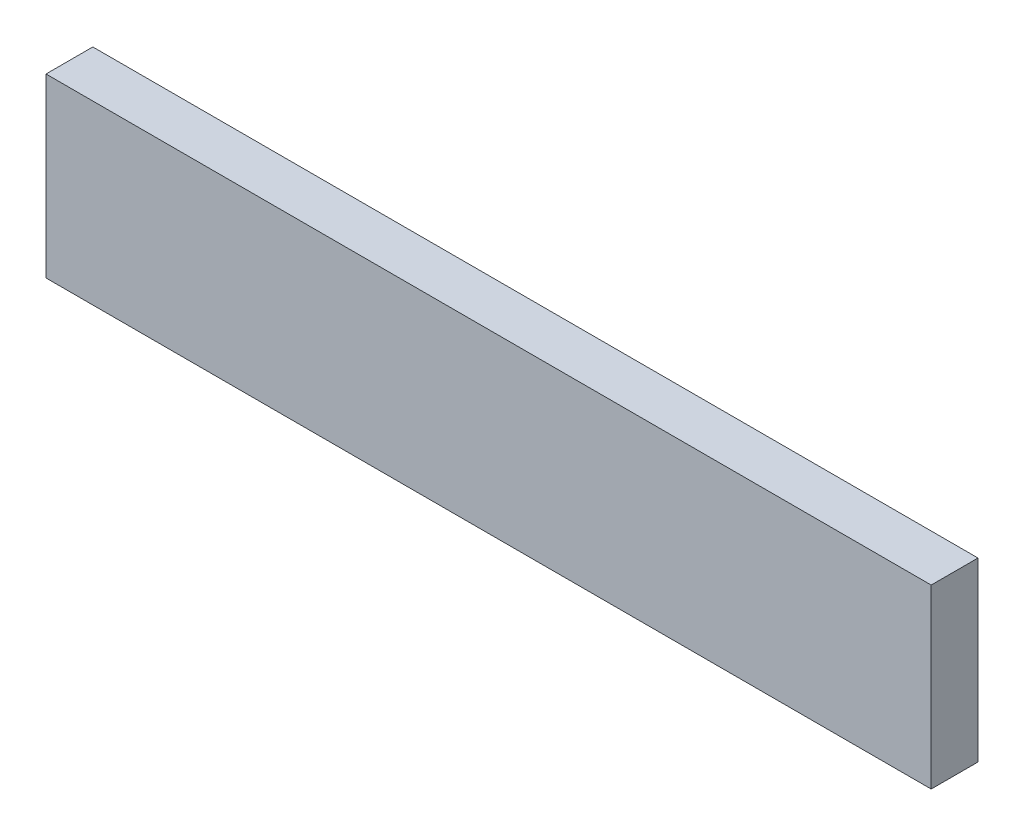
ISO-10303-21;
HEADER;
FILE_DESCRIPTION(('STEP AP214'),'2;1');
FILE_NAME('part.step','',(''),(''),'','','');
FILE_SCHEMA(('AUTOMOTIVE_DESIGN { 1 0 10303 214 1 1 1 1 }'));
ENDSEC;
DATA;
#1=APPLICATION_CONTEXT('core data for automotive mechanical design processes');
#2=APPLICATION_PROTOCOL_DEFINITION('international standard','automotive_design',2000,#1);
#3=PRODUCT_CONTEXT('',#1,'mechanical');
#4=PRODUCT('Part','Part','',(#3));
#5=PRODUCT_RELATED_PRODUCT_CATEGORY('part','',(#4));
#6=PRODUCT_DEFINITION_FORMATION('','',#4);
#7=PRODUCT_DEFINITION_CONTEXT('part definition',#1,'design');
#8=PRODUCT_DEFINITION('design','',#6,#7);
#9=PRODUCT_DEFINITION_SHAPE('','',#8);
#10=(LENGTH_UNIT() NAMED_UNIT(*) SI_UNIT(.MILLI.,.METRE.));
#11=(NAMED_UNIT(*) PLANE_ANGLE_UNIT() SI_UNIT($,.RADIAN.));
#12=(NAMED_UNIT(*) SI_UNIT($,.STERADIAN.) SOLID_ANGLE_UNIT());
#13=UNCERTAINTY_MEASURE_WITH_UNIT(LENGTH_MEASURE(1.E-05),#10,'distance_accuracy_value','');
#14=(GEOMETRIC_REPRESENTATION_CONTEXT(3) GLOBAL_UNCERTAINTY_ASSIGNED_CONTEXT((#13)) GLOBAL_UNIT_ASSIGNED_CONTEXT((#10,
#11,#12)) REPRESENTATION_CONTEXT('',''));
#15=CARTESIAN_POINT('',(0.,0.,0.));
#16=DIRECTION('',(0.,0.,1.));
#17=DIRECTION('',(1.,0.,0.));
#18=AXIS2_PLACEMENT_3D('',#15,#16,#17);
#19=CARTESIAN_POINT('',(2.505,-0.5,-0.1325));
#20=DIRECTION('',(0.,0.,1.));
#21=DIRECTION('',(1.,0.,0.));
#22=AXIS2_PLACEMENT_3D('',#19,#20,#21);
#23=PLANE('',#22);
#24=DIRECTION('',(0.,1.,0.));
#25=VECTOR('',#24,1.);
#26=CARTESIAN_POINT('',(-2.505,-0.5,-0.1325));
#27=LINE('',#26,#25);
#28=CARTESIAN_POINT('',(-2.505,-0.5,-0.1325));
#29=VERTEX_POINT('',#28);
#30=CARTESIAN_POINT('',(-2.505,0.5,-0.1325));
#31=VERTEX_POINT('',#30);
#32=EDGE_CURVE('E102',#29,#31,#27,.T.);
#33=ORIENTED_EDGE('',*,*,#32,.T.);
#34=DIRECTION('',(-1.,0.,0.));
#35=VECTOR('',#34,1.);
#36=CARTESIAN_POINT('',(2.505,0.5,-0.1325));
#37=LINE('',#36,#35);
#38=CARTESIAN_POINT('',(2.505,0.5,-0.1325));
#39=VERTEX_POINT('',#38);
#40=EDGE_CURVE('E11',#39,#31,#37,.T.);
#41=ORIENTED_EDGE('',*,*,#40,.F.);
#42=DIRECTION('',(0.,1.,0.));
#43=VECTOR('',#42,1.);
#44=CARTESIAN_POINT('',(2.505,-0.5,-0.1325));
#45=LINE('',#44,#43);
#46=CARTESIAN_POINT('',(2.505,-0.5,-0.1325));
#47=VERTEX_POINT('',#46);
#48=EDGE_CURVE('E90',#47,#39,#45,.T.);
#49=ORIENTED_EDGE('',*,*,#48,.F.);
#50=DIRECTION('',(-1.,0.,0.));
#51=VECTOR('',#50,1.);
#52=CARTESIAN_POINT('',(2.505,-0.5,-0.1325));
#53=LINE('',#52,#51);
#54=EDGE_CURVE('E98',#47,#29,#53,.T.);
#55=ORIENTED_EDGE('',*,*,#54,.T.);
#56=EDGE_LOOP('',(#33,#41,#49,#55));
#57=FACE_BOUND('',#56,.T.);
#58=ADVANCED_FACE('F39',(#57),#23,.F.);
#59=CARTESIAN_POINT('',(2.505,0.5,-0.1325));
#60=DIRECTION('',(0.,-1.,0.));
#61=DIRECTION('',(0.,0.,-1.));
#62=AXIS2_PLACEMENT_3D('',#59,#60,#61);
#63=PLANE('',#62);
#64=DIRECTION('',(0.,0.,1.));
#65=VECTOR('',#64,1.);
#66=CARTESIAN_POINT('',(-2.505,0.5,-0.1325));
#67=LINE('',#66,#65);
#68=CARTESIAN_POINT('',(-2.505,0.5,0.1325));
#69=VERTEX_POINT('',#68);
#70=EDGE_CURVE('E94',#31,#69,#67,.T.);
#71=ORIENTED_EDGE('',*,*,#70,.T.);
#72=DIRECTION('',(-1.,0.,0.));
#73=VECTOR('',#72,1.);
#74=CARTESIAN_POINT('',(2.505,0.5,0.1325));
#75=LINE('',#74,#73);
#76=CARTESIAN_POINT('',(2.505,0.5,0.1325));
#77=VERTEX_POINT('',#76);
#78=EDGE_CURVE('E47',#77,#69,#75,.T.);
#79=ORIENTED_EDGE('',*,*,#78,.F.);
#80=DIRECTION('',(0.,0.,1.));
#81=VECTOR('',#80,1.);
#82=CARTESIAN_POINT('',(2.505,0.5,-0.1325));
#83=LINE('',#82,#81);
#84=EDGE_CURVE('E85',#39,#77,#83,.T.);
#85=ORIENTED_EDGE('',*,*,#84,.F.);
#86=ORIENTED_EDGE('',*,*,#40,.T.);
#87=EDGE_LOOP('',(#71,#79,#85,#86));
#88=FACE_BOUND('',#87,.T.);
#89=ADVANCED_FACE('F93',(#88),#63,.F.);
#90=CARTESIAN_POINT('',(2.505,-0.5,0.1325));
#91=DIRECTION('',(0.,0.,-1.));
#92=DIRECTION('',(-1.,0.,0.));
#93=AXIS2_PLACEMENT_3D('',#90,#91,#92);
#94=PLANE('',#93);
#95=DIRECTION('',(0.,-1.,0.));
#96=VECTOR('',#95,1.);
#97=CARTESIAN_POINT('',(-2.505,-0.5,0.1325));
#98=LINE('',#97,#96);
#99=CARTESIAN_POINT('',(-2.505,-0.5,0.1325));
#100=VERTEX_POINT('',#99);
#101=EDGE_CURVE('E72',#69,#100,#98,.T.);
#102=ORIENTED_EDGE('',*,*,#101,.T.);
#103=DIRECTION('',(-1.,0.,0.));
#104=VECTOR('',#103,1.);
#105=CARTESIAN_POINT('',(2.505,-0.5,0.1325));
#106=LINE('',#105,#104);
#107=CARTESIAN_POINT('',(2.505,-0.5,0.1325));
#108=VERTEX_POINT('',#107);
#109=EDGE_CURVE('E95',#108,#100,#106,.T.);
#110=ORIENTED_EDGE('',*,*,#109,.F.);
#111=DIRECTION('',(0.,-1.,0.));
#112=VECTOR('',#111,1.);
#113=CARTESIAN_POINT('',(2.505,-0.5,0.1325));
#114=LINE('',#113,#112);
#115=EDGE_CURVE('E88',#77,#108,#114,.T.);
#116=ORIENTED_EDGE('',*,*,#115,.F.);
#117=ORIENTED_EDGE('',*,*,#78,.T.);
#118=EDGE_LOOP('',(#102,#110,#116,#117));
#119=FACE_BOUND('',#118,.T.);
#120=ADVANCED_FACE('F96',(#119),#94,.F.);
#121=CARTESIAN_POINT('',(2.505,-0.5,-0.1325));
#122=DIRECTION('',(0.,1.,0.));
#123=DIRECTION('',(0.,0.,1.));
#124=AXIS2_PLACEMENT_3D('',#121,#122,#123);
#125=PLANE('',#124);
#126=DIRECTION('',(0.,0.,-1.));
#127=VECTOR('',#126,1.);
#128=CARTESIAN_POINT('',(-2.505,-0.5,-0.1325));
#129=LINE('',#128,#127);
#130=EDGE_CURVE('E78',#100,#29,#129,.T.);
#131=ORIENTED_EDGE('',*,*,#130,.T.);
#132=ORIENTED_EDGE('',*,*,#54,.F.);
#133=DIRECTION('',(0.,0.,-1.));
#134=VECTOR('',#133,1.);
#135=CARTESIAN_POINT('',(2.505,-0.5,-0.1325));
#136=LINE('',#135,#134);
#137=EDGE_CURVE('E55',#108,#47,#136,.T.);
#138=ORIENTED_EDGE('',*,*,#137,.F.);
#139=ORIENTED_EDGE('',*,*,#109,.T.);
#140=EDGE_LOOP('',(#131,#132,#138,#139));
#141=FACE_BOUND('',#140,.T.);
#142=ADVANCED_FACE('F109',(#141),#125,.F.);
#143=CARTESIAN_POINT('',(2.505,0.,0.));
#144=DIRECTION('',(1.,0.,0.));
#145=DIRECTION('',(0.,0.,-1.));
#146=AXIS2_PLACEMENT_3D('',#143,#144,#145);
#147=PLANE('',#146);
#148=ORIENTED_EDGE('',*,*,#48,.T.);
#149=ORIENTED_EDGE('',*,*,#84,.T.);
#150=ORIENTED_EDGE('',*,*,#115,.T.);
#151=ORIENTED_EDGE('',*,*,#137,.T.);
#152=EDGE_LOOP('',(#148,#149,#150,#151));
#153=FACE_BOUND('',#152,.T.);
#154=ADVANCED_FACE('F86',(#153),#147,.T.);
#155=CARTESIAN_POINT('',(-2.505,0.,0.));
#156=DIRECTION('',(1.,0.,0.));
#157=DIRECTION('',(0.,0.,-1.));
#158=AXIS2_PLACEMENT_3D('',#155,#156,#157);
#159=PLANE('',#158);
#160=ORIENTED_EDGE('',*,*,#32,.F.);
#161=ORIENTED_EDGE('',*,*,#130,.F.);
#162=ORIENTED_EDGE('',*,*,#101,.F.);
#163=ORIENTED_EDGE('',*,*,#70,.F.);
#164=EDGE_LOOP('',(#160,#161,#162,#163));
#165=FACE_BOUND('',#164,.T.);
#166=ADVANCED_FACE('F112',(#165),#159,.F.);
#167=CLOSED_SHELL('',(#58,#89,#120,#142,#154,#166));
#168=MANIFOLD_SOLID_BREP('B2',#167);
#169=ADVANCED_BREP_SHAPE_REPRESENTATION('',(#18,#168),#14);
#170=SHAPE_DEFINITION_REPRESENTATION(#9,#169);
ENDSEC;
END-ISO-10303-21;
